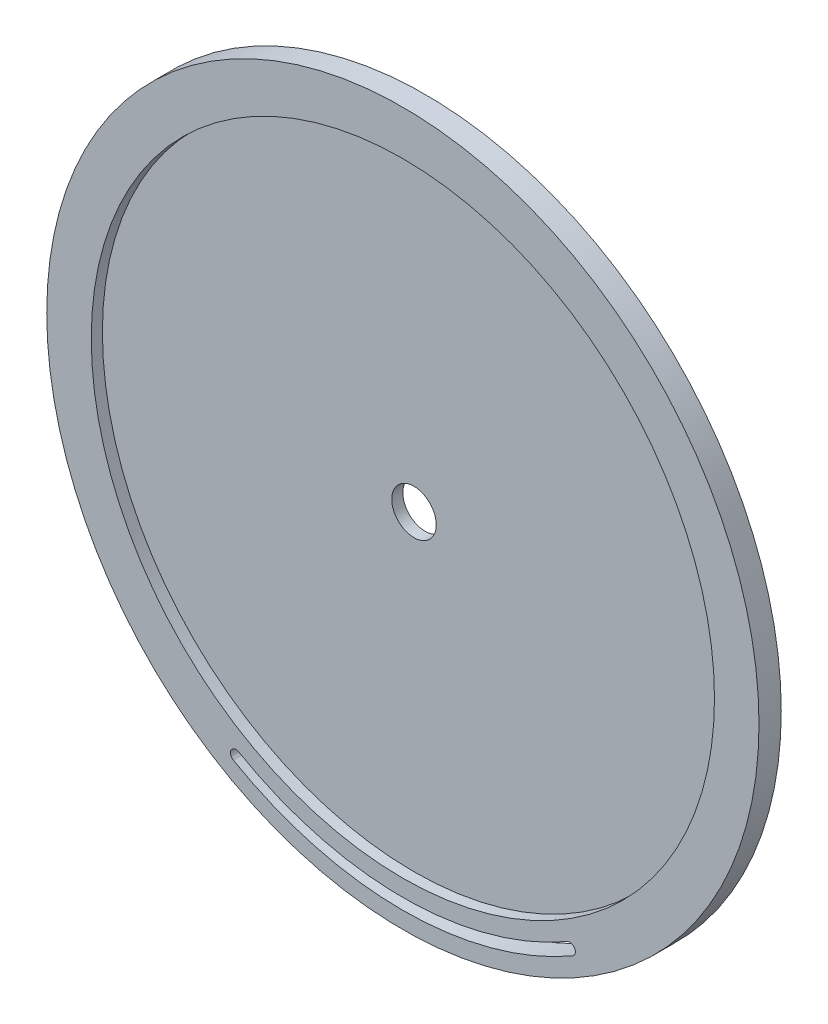
ISO-10303-21;
HEADER;
FILE_DESCRIPTION(('STEP AP214'),'2;1');
FILE_NAME('part.step','',(''),(''),'','','');
FILE_SCHEMA(('AUTOMOTIVE_DESIGN { 1 0 10303 214 1 1 1 1 }'));
ENDSEC;
DATA;
#1=APPLICATION_CONTEXT('core data for automotive mechanical design processes');
#2=APPLICATION_PROTOCOL_DEFINITION('international standard','automotive_design',2000,#1);
#3=PRODUCT_CONTEXT('',#1,'mechanical');
#4=PRODUCT('Part','Part','',(#3));
#5=PRODUCT_RELATED_PRODUCT_CATEGORY('part','',(#4));
#6=PRODUCT_DEFINITION_FORMATION('','',#4);
#7=PRODUCT_DEFINITION_CONTEXT('part definition',#1,'design');
#8=PRODUCT_DEFINITION('design','',#6,#7);
#9=PRODUCT_DEFINITION_SHAPE('','',#8);
#10=(LENGTH_UNIT() NAMED_UNIT(*) SI_UNIT(.MILLI.,.METRE.));
#11=(NAMED_UNIT(*) PLANE_ANGLE_UNIT() SI_UNIT($,.RADIAN.));
#12=(NAMED_UNIT(*) SI_UNIT($,.STERADIAN.) SOLID_ANGLE_UNIT());
#13=UNCERTAINTY_MEASURE_WITH_UNIT(LENGTH_MEASURE(1.E-05),#10,'distance_accuracy_value','');
#14=(GEOMETRIC_REPRESENTATION_CONTEXT(3) GLOBAL_UNCERTAINTY_ASSIGNED_CONTEXT((#13)) GLOBAL_UNIT_ASSIGNED_CONTEXT((#10,
#11,#12)) REPRESENTATION_CONTEXT('',''));
#15=CARTESIAN_POINT('',(0.,0.,0.));
#16=DIRECTION('',(0.,0.,1.));
#17=DIRECTION('',(1.,0.,0.));
#18=AXIS2_PLACEMENT_3D('',#15,#16,#17);
#19=CARTESIAN_POINT('',(0.,0.,6.35));
#20=DIRECTION('',(0.,0.,-1.));
#21=DIRECTION('',(-1.,0.,0.));
#22=AXIS2_PLACEMENT_3D('',#19,#20,#21);
#23=CYLINDRICAL_SURFACE('',#22,101.6);
#24=CARTESIAN_POINT('',(0.,0.,6.35));
#25=DIRECTION('',(0.,0.,1.));
#26=DIRECTION('',(1.,0.,0.));
#27=AXIS2_PLACEMENT_3D('',#24,#25,#26);
#28=CIRCLE('',#27,101.6);
#29=CARTESIAN_POINT('',(101.6,0.,6.35));
#30=VERTEX_POINT('',#29);
#31=EDGE_CURVE('E11',#30,#30,#28,.T.);
#32=ORIENTED_EDGE('',*,*,#31,.F.);
#33=EDGE_LOOP('',(#32));
#34=FACE_BOUND('',#33,.T.);
#35=CARTESIAN_POINT('',(0.,0.,0.));
#36=DIRECTION('',(0.,0.,1.));
#37=DIRECTION('',(1.,0.,0.));
#38=AXIS2_PLACEMENT_3D('',#35,#36,#37);
#39=CIRCLE('',#38,101.6);
#40=CARTESIAN_POINT('',(101.6,0.,0.));
#41=VERTEX_POINT('',#40);
#42=EDGE_CURVE('E34',#41,#41,#39,.T.);
#43=ORIENTED_EDGE('',*,*,#42,.T.);
#44=EDGE_LOOP('',(#43));
#45=FACE_BOUND('',#44,.T.);
#46=ADVANCED_FACE('F31',(#34,#45),#23,.T.);
#47=CARTESIAN_POINT('',(0.,0.,6.35));
#48=DIRECTION('',(0.,0.,1.));
#49=DIRECTION('',(1.,0.,0.));
#50=AXIS2_PLACEMENT_3D('',#47,#48,#49);
#51=PLANE('',#50);
#52=CARTESIAN_POINT('',(0.,0.,6.35));
#53=DIRECTION('',(0.,0.,1.));
#54=DIRECTION('',(1.,0.,0.));
#55=AXIS2_PLACEMENT_3D('',#52,#53,#54);
#56=CIRCLE('',#55,93.6625);
#57=CARTESIAN_POINT('',(46.83125,-81.11410438196,6.35));
#58=VERTEX_POINT('',#57);
#59=CARTESIAN_POINT('',(-46.83125,-81.11410438196,6.35));
#60=VERTEX_POINT('',#59);
#61=EDGE_CURVE('E45',#58,#60,#56,.F.);
#62=ORIENTED_EDGE('',*,*,#61,.F.);
#63=CARTESIAN_POINT('',(47.625,-82.4889197104678,6.35));
#64=DIRECTION('',(0.,0.,1.));
#65=DIRECTION('',(1.,0.,0.));
#66=AXIS2_PLACEMENT_3D('',#63,#64,#65);
#67=CIRCLE('',#66,1.58750000000001);
#68=CARTESIAN_POINT('',(48.41875,-83.8637350389756,6.35));
#69=VERTEX_POINT('',#68);
#70=EDGE_CURVE('E87',#58,#69,#67,.F.);
#71=ORIENTED_EDGE('',*,*,#70,.T.);
#72=CARTESIAN_POINT('',(0.,0.,6.35));
#73=DIRECTION('',(0.,0.,1.));
#74=DIRECTION('',(1.,0.,0.));
#75=AXIS2_PLACEMENT_3D('',#72,#73,#74);
#76=CIRCLE('',#75,96.8375);
#77=CARTESIAN_POINT('',(-48.41875,-83.8637350389756,6.35));
#78=VERTEX_POINT('',#77);
#79=EDGE_CURVE('E90',#69,#78,#76,.F.);
#80=ORIENTED_EDGE('',*,*,#79,.T.);
#81=CARTESIAN_POINT('',(-47.625,-82.4889197104678,6.35));
#82=DIRECTION('',(0.,0.,1.));
#83=DIRECTION('',(1.,0.,0.));
#84=AXIS2_PLACEMENT_3D('',#81,#82,#83);
#85=CIRCLE('',#84,1.58750000000001);
#86=EDGE_CURVE('E99',#60,#78,#85,.T.);
#87=ORIENTED_EDGE('',*,*,#86,.F.);
#88=EDGE_LOOP('',(#62,#71,#80,#87));
#89=FACE_BOUND('',#88,.T.);
#90=CARTESIAN_POINT('',(0.,0.,6.35));
#91=DIRECTION('',(0.,0.,1.));
#92=DIRECTION('',(1.,0.,0.));
#93=AXIS2_PLACEMENT_3D('',#90,#91,#92);
#94=CIRCLE('',#93,88.9);
#95=CARTESIAN_POINT('',(88.9,0.,6.35));
#96=VERTEX_POINT('',#95);
#97=EDGE_CURVE('E105',#96,#96,#94,.T.);
#98=ORIENTED_EDGE('',*,*,#97,.F.);
#99=EDGE_LOOP('',(#98));
#100=FACE_BOUND('',#99,.T.);
#101=ORIENTED_EDGE('',*,*,#31,.T.);
#102=EDGE_LOOP('',(#101));
#103=FACE_BOUND('',#102,.T.);
#104=ADVANCED_FACE('F117',(#89,#100,#103),#51,.T.);
#105=CARTESIAN_POINT('',(0.,0.,0.));
#106=DIRECTION('',(0.,0.,1.));
#107=DIRECTION('',(1.,0.,0.));
#108=AXIS2_PLACEMENT_3D('',#105,#106,#107);
#109=PLANE('',#108);
#110=CARTESIAN_POINT('',(0.,0.,0.));
#111=DIRECTION('',(0.,0.,1.));
#112=DIRECTION('',(1.,0.,0.));
#113=AXIS2_PLACEMENT_3D('',#110,#111,#112);
#114=CIRCLE('',#113,6.35);
#115=CARTESIAN_POINT('',(6.35,0.,0.));
#116=VERTEX_POINT('',#115);
#117=EDGE_CURVE('E93',#116,#116,#114,.T.);
#118=ORIENTED_EDGE('',*,*,#117,.T.);
#119=EDGE_LOOP('',(#118));
#120=FACE_BOUND('',#119,.T.);
#121=CARTESIAN_POINT('',(47.625,-82.4889197104678,0.));
#122=DIRECTION('',(0.,0.,1.));
#123=DIRECTION('',(1.,0.,0.));
#124=AXIS2_PLACEMENT_3D('',#121,#122,#123);
#125=CIRCLE('',#124,1.58750000000001);
#126=CARTESIAN_POINT('',(46.83125,-81.11410438196,0.));
#127=VERTEX_POINT('',#126);
#128=CARTESIAN_POINT('',(48.41875,-83.8637350389756,0.));
#129=VERTEX_POINT('',#128);
#130=EDGE_CURVE('E76',#127,#129,#125,.F.);
#131=ORIENTED_EDGE('',*,*,#130,.F.);
#132=CARTESIAN_POINT('',(0.,0.,0.));
#133=DIRECTION('',(0.,0.,1.));
#134=DIRECTION('',(1.,0.,0.));
#135=AXIS2_PLACEMENT_3D('',#132,#133,#134);
#136=CIRCLE('',#135,93.6625);
#137=CARTESIAN_POINT('',(-46.83125,-81.11410438196,0.));
#138=VERTEX_POINT('',#137);
#139=EDGE_CURVE('E73',#127,#138,#136,.F.);
#140=ORIENTED_EDGE('',*,*,#139,.T.);
#141=CARTESIAN_POINT('',(-47.625,-82.4889197104678,0.));
#142=DIRECTION('',(0.,0.,1.));
#143=DIRECTION('',(1.,0.,0.));
#144=AXIS2_PLACEMENT_3D('',#141,#142,#143);
#145=CIRCLE('',#144,1.58750000000001);
#146=CARTESIAN_POINT('',(-48.41875,-83.8637350389756,0.));
#147=VERTEX_POINT('',#146);
#148=EDGE_CURVE('E79',#138,#147,#145,.T.);
#149=ORIENTED_EDGE('',*,*,#148,.T.);
#150=CARTESIAN_POINT('',(0.,0.,0.));
#151=DIRECTION('',(0.,0.,1.));
#152=DIRECTION('',(1.,0.,0.));
#153=AXIS2_PLACEMENT_3D('',#150,#151,#152);
#154=CIRCLE('',#153,96.8375);
#155=EDGE_CURVE('E83',#129,#147,#154,.F.);
#156=ORIENTED_EDGE('',*,*,#155,.F.);
#157=EDGE_LOOP('',(#131,#140,#149,#156));
#158=FACE_BOUND('',#157,.T.);
#159=ORIENTED_EDGE('',*,*,#42,.F.);
#160=EDGE_LOOP('',(#159));
#161=FACE_BOUND('',#160,.T.);
#162=ADVANCED_FACE('F85',(#120,#158,#161),#109,.F.);
#163=CARTESIAN_POINT('',(0.,0.,3.175));
#164=DIRECTION('',(0.,0.,1.));
#165=DIRECTION('',(1.,0.,0.));
#166=AXIS2_PLACEMENT_3D('',#163,#164,#165);
#167=CYLINDRICAL_SURFACE('',#166,88.9);
#168=CARTESIAN_POINT('',(0.,0.,3.175));
#169=DIRECTION('',(0.,0.,1.));
#170=DIRECTION('',(1.,0.,0.));
#171=AXIS2_PLACEMENT_3D('',#168,#169,#170);
#172=CIRCLE('',#171,88.9);
#173=CARTESIAN_POINT('',(88.9,0.,3.175));
#174=VERTEX_POINT('',#173);
#175=EDGE_CURVE('E109',#174,#174,#172,.T.);
#176=ORIENTED_EDGE('',*,*,#175,.F.);
#177=EDGE_LOOP('',(#176));
#178=FACE_BOUND('',#177,.T.);
#179=ORIENTED_EDGE('',*,*,#97,.T.);
#180=EDGE_LOOP('',(#179));
#181=FACE_BOUND('',#180,.T.);
#182=ADVANCED_FACE('F115',(#178,#181),#167,.F.);
#183=CARTESIAN_POINT('',(0.,0.,3.175));
#184=DIRECTION('',(0.,0.,1.));
#185=DIRECTION('',(1.,0.,0.));
#186=AXIS2_PLACEMENT_3D('',#183,#184,#185);
#187=PLANE('',#186);
#188=CARTESIAN_POINT('',(0.,0.,3.175));
#189=DIRECTION('',(0.,0.,1.));
#190=DIRECTION('',(1.,0.,0.));
#191=AXIS2_PLACEMENT_3D('',#188,#189,#190);
#192=CIRCLE('',#191,6.35);
#193=CARTESIAN_POINT('',(6.35,0.,3.175));
#194=VERTEX_POINT('',#193);
#195=EDGE_CURVE('E161',#194,#194,#192,.T.);
#196=ORIENTED_EDGE('',*,*,#195,.F.);
#197=EDGE_LOOP('',(#196));
#198=FACE_BOUND('',#197,.T.);
#199=ORIENTED_EDGE('',*,*,#175,.T.);
#200=EDGE_LOOP('',(#199));
#201=FACE_BOUND('',#200,.T.);
#202=ADVANCED_FACE('F133',(#198,#201),#187,.T.);
#203=CARTESIAN_POINT('',(0.,0.,0.));
#204=DIRECTION('',(0.,0.,1.));
#205=DIRECTION('',(1.,0.,0.));
#206=AXIS2_PLACEMENT_3D('',#203,#204,#205);
#207=CYLINDRICAL_SURFACE('',#206,93.6625);
#208=ORIENTED_EDGE('',*,*,#61,.T.);
#209=DIRECTION('',(0.,0.,1.));
#210=VECTOR('',#209,1.);
#211=CARTESIAN_POINT('',(-46.83125,-81.11410438196,0.));
#212=LINE('',#211,#210);
#213=EDGE_CURVE('E70',#138,#60,#212,.T.);
#214=ORIENTED_EDGE('',*,*,#213,.F.);
#215=ORIENTED_EDGE('',*,*,#139,.F.);
#216=DIRECTION('',(0.,0.,1.));
#217=VECTOR('',#216,1.);
#218=CARTESIAN_POINT('',(46.83125,-81.11410438196,0.));
#219=LINE('',#218,#217);
#220=EDGE_CURVE('E103',#127,#58,#219,.T.);
#221=ORIENTED_EDGE('',*,*,#220,.T.);
#222=EDGE_LOOP('',(#208,#214,#215,#221));
#223=FACE_BOUND('',#222,.T.);
#224=ADVANCED_FACE('F71',(#223),#207,.T.);
#225=CARTESIAN_POINT('',(47.625,-82.4889197104678,0.));
#226=DIRECTION('',(0.,0.,1.));
#227=DIRECTION('',(1.,0.,0.));
#228=AXIS2_PLACEMENT_3D('',#225,#226,#227);
#229=CYLINDRICAL_SURFACE('',#228,1.58750000000001);
#230=ORIENTED_EDGE('',*,*,#70,.F.);
#231=ORIENTED_EDGE('',*,*,#220,.F.);
#232=ORIENTED_EDGE('',*,*,#130,.T.);
#233=DIRECTION('',(0.,0.,1.));
#234=VECTOR('',#233,1.);
#235=CARTESIAN_POINT('',(48.41875,-83.8637350389756,0.));
#236=LINE('',#235,#234);
#237=EDGE_CURVE('E106',#129,#69,#236,.T.);
#238=ORIENTED_EDGE('',*,*,#237,.T.);
#239=EDGE_LOOP('',(#230,#231,#232,#238));
#240=FACE_BOUND('',#239,.T.);
#241=ADVANCED_FACE('F143',(#240),#229,.F.);
#242=CARTESIAN_POINT('',(0.,0.,0.));
#243=DIRECTION('',(0.,0.,1.));
#244=DIRECTION('',(1.,0.,0.));
#245=AXIS2_PLACEMENT_3D('',#242,#243,#244);
#246=CYLINDRICAL_SURFACE('',#245,96.8375);
#247=ORIENTED_EDGE('',*,*,#79,.F.);
#248=ORIENTED_EDGE('',*,*,#237,.F.);
#249=ORIENTED_EDGE('',*,*,#155,.T.);
#250=DIRECTION('',(0.,0.,1.));
#251=VECTOR('',#250,1.);
#252=CARTESIAN_POINT('',(-48.41875,-83.8637350389756,0.));
#253=LINE('',#252,#251);
#254=EDGE_CURVE('E53',#147,#78,#253,.T.);
#255=ORIENTED_EDGE('',*,*,#254,.T.);
#256=EDGE_LOOP('',(#247,#248,#249,#255));
#257=FACE_BOUND('',#256,.T.);
#258=ADVANCED_FACE('F147',(#257),#246,.F.);
#259=CARTESIAN_POINT('',(-47.625,-82.4889197104678,0.));
#260=DIRECTION('',(0.,0.,1.));
#261=DIRECTION('',(1.,0.,0.));
#262=AXIS2_PLACEMENT_3D('',#259,#260,#261);
#263=CYLINDRICAL_SURFACE('',#262,1.58750000000001);
#264=ORIENTED_EDGE('',*,*,#86,.T.);
#265=ORIENTED_EDGE('',*,*,#254,.F.);
#266=ORIENTED_EDGE('',*,*,#148,.F.);
#267=ORIENTED_EDGE('',*,*,#213,.T.);
#268=EDGE_LOOP('',(#264,#265,#266,#267));
#269=FACE_BOUND('',#268,.T.);
#270=ADVANCED_FACE('F80',(#269),#263,.F.);
#271=CARTESIAN_POINT('',(0.,0.,-3.175));
#272=DIRECTION('',(0.,0.,1.));
#273=DIRECTION('',(1.,0.,0.));
#274=AXIS2_PLACEMENT_3D('',#271,#272,#273);
#275=CYLINDRICAL_SURFACE('',#274,6.35);
#276=ORIENTED_EDGE('',*,*,#195,.T.);
#277=EDGE_LOOP('',(#276));
#278=FACE_BOUND('',#277,.T.);
#279=ORIENTED_EDGE('',*,*,#117,.F.);
#280=EDGE_LOOP('',(#279));
#281=FACE_BOUND('',#280,.T.);
#282=ADVANCED_FACE('F146',(#278,#281),#275,.F.);
#283=CLOSED_SHELL('',(#46,#104,#162,#182,#202,#224,#241,#258,#270,#282));
#284=MANIFOLD_SOLID_BREP('B2',#283);
#285=ADVANCED_BREP_SHAPE_REPRESENTATION('',(#18,#284),#14);
#286=SHAPE_DEFINITION_REPRESENTATION(#9,#285);
ENDSEC;
END-ISO-10303-21;
